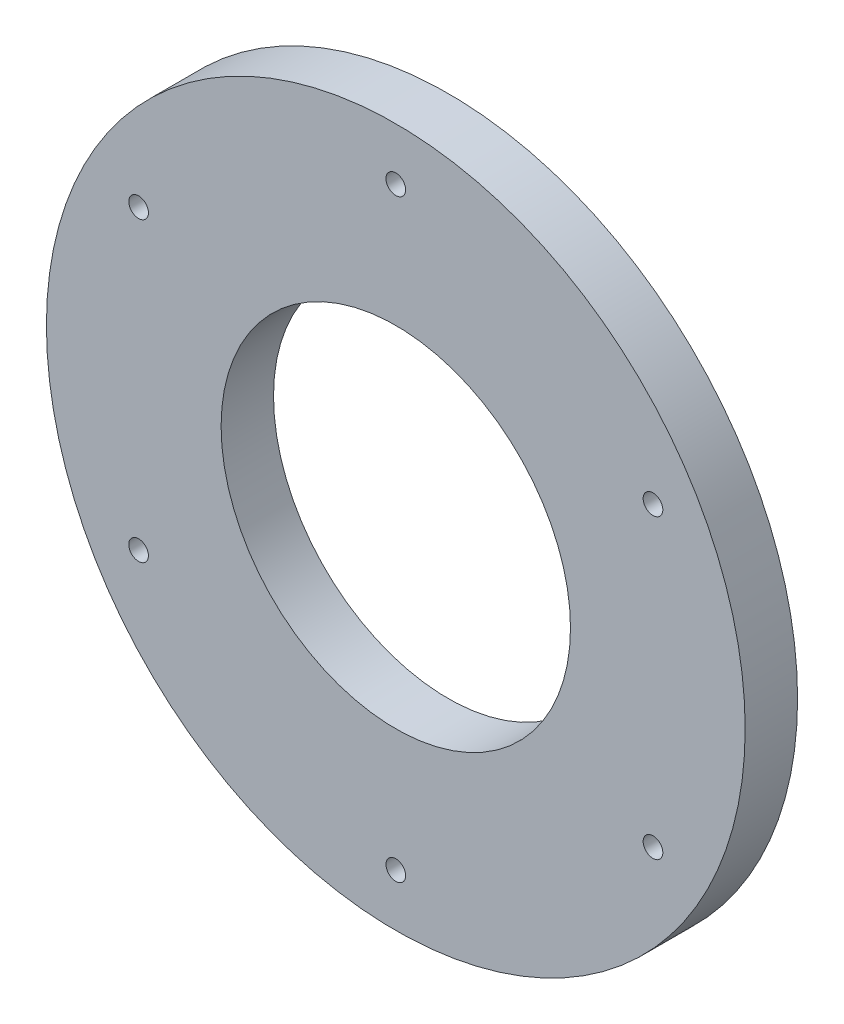
ISO-10303-21;
HEADER;
FILE_DESCRIPTION(('STEP AP214'),'2;1');
FILE_NAME('part.step','',(''),(''),'','','');
FILE_SCHEMA(('AUTOMOTIVE_DESIGN { 1 0 10303 214 1 1 1 1 }'));
ENDSEC;
DATA;
#1=APPLICATION_CONTEXT('core data for automotive mechanical design processes');
#2=APPLICATION_PROTOCOL_DEFINITION('international standard','automotive_design',2000,#1);
#3=PRODUCT_CONTEXT('',#1,'mechanical');
#4=PRODUCT('Part','Part','',(#3));
#5=PRODUCT_RELATED_PRODUCT_CATEGORY('part','',(#4));
#6=PRODUCT_DEFINITION_FORMATION('','',#4);
#7=PRODUCT_DEFINITION_CONTEXT('part definition',#1,'design');
#8=PRODUCT_DEFINITION('design','',#6,#7);
#9=PRODUCT_DEFINITION_SHAPE('','',#8);
#10=(LENGTH_UNIT() NAMED_UNIT(*) SI_UNIT(.MILLI.,.METRE.));
#11=(NAMED_UNIT(*) PLANE_ANGLE_UNIT() SI_UNIT($,.RADIAN.));
#12=(NAMED_UNIT(*) SI_UNIT($,.STERADIAN.) SOLID_ANGLE_UNIT());
#13=UNCERTAINTY_MEASURE_WITH_UNIT(LENGTH_MEASURE(1.E-05),#10,'distance_accuracy_value','');
#14=(GEOMETRIC_REPRESENTATION_CONTEXT(3) GLOBAL_UNCERTAINTY_ASSIGNED_CONTEXT((#13)) GLOBAL_UNIT_ASSIGNED_CONTEXT((#10,
#11,#12)) REPRESENTATION_CONTEXT('',''));
#15=CARTESIAN_POINT('',(0.,0.,0.));
#16=DIRECTION('',(0.,0.,1.));
#17=DIRECTION('',(1.,0.,0.));
#18=AXIS2_PLACEMENT_3D('',#15,#16,#17);
#19=CARTESIAN_POINT('',(0.,0.,19.05));
#20=DIRECTION('',(0.,0.,-1.));
#21=DIRECTION('',(-1.,0.,0.));
#22=AXIS2_PLACEMENT_3D('',#19,#20,#21);
#23=CYLINDRICAL_SURFACE('',#22,127.);
#24=CARTESIAN_POINT('',(0.,0.,19.05));
#25=DIRECTION('',(0.,0.,1.));
#26=DIRECTION('',(1.,0.,0.));
#27=AXIS2_PLACEMENT_3D('',#24,#25,#26);
#28=CIRCLE('',#27,127.);
#29=CARTESIAN_POINT('',(-127.,0.,19.05));
#30=VERTEX_POINT('',#29);
#31=EDGE_CURVE('E10',#30,#30,#28,.T.);
#32=CARTESIAN_POINT('',(0.,0.,0.));
#33=DIRECTION('',(0.,0.,1.));
#34=DIRECTION('',(1.,0.,0.));
#35=AXIS2_PLACEMENT_3D('',#32,#33,#34);
#36=CIRCLE('',#35,127.);
#37=CARTESIAN_POINT('',(-127.,0.,0.));
#38=VERTEX_POINT('',#37);
#39=EDGE_CURVE('E45',#38,#38,#36,.T.);
#40=CARTESIAN_POINT('',(-127.,0.,19.05));
#41=CARTESIAN_POINT('',(-127.,0.,18.8515625));
#42=CARTESIAN_POINT('',(-127.,0.,18.653125));
#43=CARTESIAN_POINT('',(-127.,0.,18.25625));
#44=CARTESIAN_POINT('',(-127.,0.,18.0578125));
#45=CARTESIAN_POINT('',(-127.,0.,17.6609375));
#46=CARTESIAN_POINT('',(-127.,0.,17.4625));
#47=CARTESIAN_POINT('',(-127.,0.,17.065625));
#48=CARTESIAN_POINT('',(-127.,0.,16.8671875));
#49=CARTESIAN_POINT('',(-127.,0.,16.4703125));
#50=CARTESIAN_POINT('',(-127.,0.,16.271875));
#51=CARTESIAN_POINT('',(-127.,0.,15.875));
#52=CARTESIAN_POINT('',(-127.,0.,15.6765625));
#53=CARTESIAN_POINT('',(-127.,0.,15.2796875));
#54=CARTESIAN_POINT('',(-127.,0.,15.08125));
#55=CARTESIAN_POINT('',(-127.,0.,14.684375));
#56=CARTESIAN_POINT('',(-127.,0.,14.4859375));
#57=CARTESIAN_POINT('',(-127.,0.,14.0890625));
#58=CARTESIAN_POINT('',(-127.,0.,13.890625));
#59=CARTESIAN_POINT('',(-127.,0.,13.49375));
#60=CARTESIAN_POINT('',(-127.,0.,13.2953125));
#61=CARTESIAN_POINT('',(-127.,0.,12.8984375));
#62=CARTESIAN_POINT('',(-127.,0.,12.7));
#63=CARTESIAN_POINT('',(-127.,0.,12.303125));
#64=CARTESIAN_POINT('',(-127.,0.,12.1046875));
#65=CARTESIAN_POINT('',(-127.,0.,11.7078125));
#66=CARTESIAN_POINT('',(-127.,0.,11.509375));
#67=CARTESIAN_POINT('',(-127.,0.,11.1125));
#68=CARTESIAN_POINT('',(-127.,0.,10.9140625));
#69=CARTESIAN_POINT('',(-127.,0.,10.5171875));
#70=CARTESIAN_POINT('',(-127.,0.,10.31875));
#71=CARTESIAN_POINT('',(-127.,0.,9.921875));
#72=CARTESIAN_POINT('',(-127.,0.,9.7234375));
#73=CARTESIAN_POINT('',(-127.,0.,9.3265625));
#74=CARTESIAN_POINT('',(-127.,0.,9.128125));
#75=CARTESIAN_POINT('',(-127.,0.,8.73125));
#76=CARTESIAN_POINT('',(-127.,0.,8.5328125));
#77=CARTESIAN_POINT('',(-127.,0.,8.1359375));
#78=CARTESIAN_POINT('',(-127.,0.,7.9375));
#79=CARTESIAN_POINT('',(-127.,0.,7.540625));
#80=CARTESIAN_POINT('',(-127.,0.,7.3421875));
#81=CARTESIAN_POINT('',(-127.,0.,6.9453125));
#82=CARTESIAN_POINT('',(-127.,0.,6.746875));
#83=CARTESIAN_POINT('',(-127.,0.,6.35));
#84=CARTESIAN_POINT('',(-127.,0.,6.1515625));
#85=CARTESIAN_POINT('',(-127.,0.,5.7546875));
#86=CARTESIAN_POINT('',(-127.,0.,5.55625));
#87=CARTESIAN_POINT('',(-127.,0.,5.159375));
#88=CARTESIAN_POINT('',(-127.,0.,4.9609375));
#89=CARTESIAN_POINT('',(-127.,0.,4.5640625));
#90=CARTESIAN_POINT('',(-127.,0.,4.365625));
#91=CARTESIAN_POINT('',(-127.,0.,3.96875));
#92=CARTESIAN_POINT('',(-127.,0.,3.7703125));
#93=CARTESIAN_POINT('',(-127.,0.,3.3734375));
#94=CARTESIAN_POINT('',(-127.,0.,3.175));
#95=CARTESIAN_POINT('',(-127.,0.,2.778125));
#96=CARTESIAN_POINT('',(-127.,0.,2.5796875));
#97=CARTESIAN_POINT('',(-127.,0.,2.1828125));
#98=CARTESIAN_POINT('',(-127.,0.,1.984375));
#99=CARTESIAN_POINT('',(-127.,0.,1.5875));
#100=CARTESIAN_POINT('',(-127.,0.,1.3890625));
#101=CARTESIAN_POINT('',(-127.,0.,0.992187500000001));
#102=CARTESIAN_POINT('',(-127.,0.,0.793750000000001));
#103=CARTESIAN_POINT('',(-127.,0.,0.396875));
#104=CARTESIAN_POINT('',(-127.,0.,0.1984375));
#105=CARTESIAN_POINT('',(-127.,0.,0.));
#106=B_SPLINE_CURVE_WITH_KNOTS('',3,(#40,#41,#42,#43,#44,#45,#46,#47,#48,#49,#50,#51,#52,#53,
#54,#55,#56,#57,#58,#59,#60,#61,#62,#63,#64,#65,#66,#67,#68,#69,#70,#71,#72,#73,#74,#75,#76,#77,
#78,#79,#80,#81,#82,#83,#84,#85,#86,#87,#88,#89,#90,#91,#92,#93,#94,#95,#96,#97,#98,#99,#100,
#101,#102,#103,#104,#105),.UNSPECIFIED.,.F.,.F.,(4,2,2,2,2,2,2,2,2,2,2,2,2,2,2,2,2,2,2,2,2,2,2,
2,2,2,2,2,2,2,2,2,4),(0.,0.595312499999997,1.190625,1.7859375,2.38125,2.9765625,3.571875,
4.1671875,4.7625,5.3578125,5.953125,6.5484375,7.14375,7.7390625,8.334375,8.9296875,9.525,
10.1203125,10.715625,11.3109375,11.90625,12.5015625,13.096875,13.6921875,14.2875,14.8828125,
15.478125,16.0734375,16.66875,17.2640625,17.859375,18.4546875,19.05),.UNSPECIFIED.);
#107=EDGE_CURVE('BSEAM42',#30,#38,#106,.T.);
#108=ORIENTED_EDGE('',*,*,#31,.F.);
#109=ORIENTED_EDGE('',*,*,#39,.T.);
#110=ORIENTED_EDGE('',*,*,#107,.T.);
#111=ORIENTED_EDGE('',*,*,#107,.F.);
#112=EDGE_LOOP('',(#108,#110,#109,#111));
#113=FACE_BOUND('',#112,.T.);
#114=ADVANCED_FACE('F42',(#113),#23,.T.);
#115=CARTESIAN_POINT('',(0.,0.,19.05));
#116=DIRECTION('',(0.,0.,1.));
#117=DIRECTION('',(1.,0.,0.));
#118=AXIS2_PLACEMENT_3D('',#115,#116,#117);
#119=PLANE('',#118);
#120=CARTESIAN_POINT('',(0.,0.,19.05));
#121=DIRECTION('',(0.,0.,1.));
#122=DIRECTION('',(1.,0.,0.));
#123=AXIS2_PLACEMENT_3D('',#120,#121,#122);
#124=CIRCLE('',#123,63.5);
#125=CARTESIAN_POINT('',(63.5,0.,19.05));
#126=VERTEX_POINT('',#125);
#127=EDGE_CURVE('E107',#126,#126,#124,.T.);
#128=ORIENTED_EDGE('',*,*,#127,.F.);
#129=EDGE_LOOP('',(#128));
#130=FACE_BOUND('',#129,.T.);
#131=CARTESIAN_POINT('',(0.,107.95,19.05));
#132=DIRECTION('',(0.,0.,1.));
#133=DIRECTION('',(1.,0.,0.));
#134=AXIS2_PLACEMENT_3D('',#131,#132,#133);
#135=CIRCLE('',#134,3.57124);
#136=CARTESIAN_POINT('',(3.57124,107.95,19.05));
#137=VERTEX_POINT('',#136);
#138=EDGE_CURVE('E99',#137,#137,#135,.T.);
#139=ORIENTED_EDGE('',*,*,#138,.F.);
#140=EDGE_LOOP('',(#139));
#141=FACE_BOUND('',#140,.T.);
#142=CARTESIAN_POINT('',(93.4874423385301,53.975,19.05));
#143=DIRECTION('',(0.,0.,1.));
#144=DIRECTION('',(1.,0.,0.));
#145=AXIS2_PLACEMENT_3D('',#142,#143,#144);
#146=CIRCLE('',#145,3.57124);
#147=CARTESIAN_POINT('',(97.0586823385301,53.975,19.05));
#148=VERTEX_POINT('',#147);
#149=EDGE_CURVE('E91',#148,#148,#146,.T.);
#150=ORIENTED_EDGE('',*,*,#149,.F.);
#151=EDGE_LOOP('',(#150));
#152=FACE_BOUND('',#151,.T.);
#153=CARTESIAN_POINT('',(93.4874423385302,-53.975,19.05));
#154=DIRECTION('',(0.,0.,1.));
#155=DIRECTION('',(1.,0.,0.));
#156=AXIS2_PLACEMENT_3D('',#153,#154,#155);
#157=CIRCLE('',#156,3.57124);
#158=CARTESIAN_POINT('',(97.0586823385302,-53.975,19.05));
#159=VERTEX_POINT('',#158);
#160=EDGE_CURVE('E83',#159,#159,#157,.T.);
#161=ORIENTED_EDGE('',*,*,#160,.F.);
#162=EDGE_LOOP('',(#161));
#163=FACE_BOUND('',#162,.T.);
#164=CARTESIAN_POINT('',(0.,-107.95,19.05));
#165=DIRECTION('',(0.,0.,1.));
#166=DIRECTION('',(1.,0.,0.));
#167=AXIS2_PLACEMENT_3D('',#164,#165,#166);
#168=CIRCLE('',#167,3.57124);
#169=CARTESIAN_POINT('',(3.57124000000001,-107.95,19.05));
#170=VERTEX_POINT('',#169);
#171=EDGE_CURVE('E75',#170,#170,#168,.T.);
#172=ORIENTED_EDGE('',*,*,#171,.F.);
#173=EDGE_LOOP('',(#172));
#174=FACE_BOUND('',#173,.T.);
#175=CARTESIAN_POINT('',(-93.4874423385301,-53.975,19.05));
#176=DIRECTION('',(0.,0.,1.));
#177=DIRECTION('',(1.,0.,0.));
#178=AXIS2_PLACEMENT_3D('',#175,#176,#177);
#179=CIRCLE('',#178,3.57124);
#180=CARTESIAN_POINT('',(-89.9162023385301,-53.975,19.05));
#181=VERTEX_POINT('',#180);
#182=EDGE_CURVE('E67',#181,#181,#179,.T.);
#183=ORIENTED_EDGE('',*,*,#182,.F.);
#184=EDGE_LOOP('',(#183));
#185=FACE_BOUND('',#184,.T.);
#186=CARTESIAN_POINT('',(-93.4874423385302,53.975,19.05));
#187=DIRECTION('',(0.,0.,1.));
#188=DIRECTION('',(1.,0.,0.));
#189=AXIS2_PLACEMENT_3D('',#186,#187,#188);
#190=CIRCLE('',#189,3.57124);
#191=CARTESIAN_POINT('',(-89.9162023385302,53.975,19.05));
#192=VERTEX_POINT('',#191);
#193=EDGE_CURVE('E59',#192,#192,#190,.T.);
#194=ORIENTED_EDGE('',*,*,#193,.F.);
#195=EDGE_LOOP('',(#194));
#196=FACE_BOUND('',#195,.T.);
#197=ORIENTED_EDGE('',*,*,#31,.T.);
#198=EDGE_LOOP('',(#197));
#199=FACE_BOUND('',#198,.T.);
#200=ADVANCED_FACE('F115',(#130,#141,#152,#163,#174,#185,#196,#199),#119,.T.);
#201=CARTESIAN_POINT('',(0.,0.,0.));
#202=DIRECTION('',(0.,0.,1.));
#203=DIRECTION('',(1.,0.,0.));
#204=AXIS2_PLACEMENT_3D('',#201,#202,#203);
#205=PLANE('',#204);
#206=CARTESIAN_POINT('',(0.,0.,0.));
#207=DIRECTION('',(0.,0.,1.));
#208=DIRECTION('',(1.,0.,0.));
#209=AXIS2_PLACEMENT_3D('',#206,#207,#208);
#210=CIRCLE('',#209,63.5);
#211=CARTESIAN_POINT('',(63.5,0.,0.));
#212=VERTEX_POINT('',#211);
#213=EDGE_CURVE('E103',#212,#212,#210,.F.);
#214=ORIENTED_EDGE('',*,*,#213,.F.);
#215=EDGE_LOOP('',(#214));
#216=FACE_BOUND('',#215,.T.);
#217=CARTESIAN_POINT('',(0.,107.95,0.));
#218=DIRECTION('',(0.,0.,1.));
#219=DIRECTION('',(1.,0.,0.));
#220=AXIS2_PLACEMENT_3D('',#217,#218,#219);
#221=CIRCLE('',#220,3.57124);
#222=CARTESIAN_POINT('',(3.57124,107.95,0.));
#223=VERTEX_POINT('',#222);
#224=EDGE_CURVE('E95',#223,#223,#221,.T.);
#225=ORIENTED_EDGE('',*,*,#224,.T.);
#226=EDGE_LOOP('',(#225));
#227=FACE_BOUND('',#226,.T.);
#228=CARTESIAN_POINT('',(93.4874423385301,53.975,0.));
#229=DIRECTION('',(0.,0.,1.));
#230=DIRECTION('',(1.,0.,0.));
#231=AXIS2_PLACEMENT_3D('',#228,#229,#230);
#232=CIRCLE('',#231,3.57124);
#233=CARTESIAN_POINT('',(97.0586823385301,53.975,0.));
#234=VERTEX_POINT('',#233);
#235=EDGE_CURVE('E87',#234,#234,#232,.T.);
#236=ORIENTED_EDGE('',*,*,#235,.T.);
#237=EDGE_LOOP('',(#236));
#238=FACE_BOUND('',#237,.T.);
#239=CARTESIAN_POINT('',(93.4874423385302,-53.975,0.));
#240=DIRECTION('',(0.,0.,1.));
#241=DIRECTION('',(1.,0.,0.));
#242=AXIS2_PLACEMENT_3D('',#239,#240,#241);
#243=CIRCLE('',#242,3.57124);
#244=CARTESIAN_POINT('',(97.0586823385302,-53.975,0.));
#245=VERTEX_POINT('',#244);
#246=EDGE_CURVE('E79',#245,#245,#243,.T.);
#247=ORIENTED_EDGE('',*,*,#246,.T.);
#248=EDGE_LOOP('',(#247));
#249=FACE_BOUND('',#248,.T.);
#250=CARTESIAN_POINT('',(0.,-107.95,0.));
#251=DIRECTION('',(0.,0.,1.));
#252=DIRECTION('',(1.,0.,0.));
#253=AXIS2_PLACEMENT_3D('',#250,#251,#252);
#254=CIRCLE('',#253,3.57124);
#255=CARTESIAN_POINT('',(3.57124000000001,-107.95,0.));
#256=VERTEX_POINT('',#255);
#257=EDGE_CURVE('E71',#256,#256,#254,.T.);
#258=ORIENTED_EDGE('',*,*,#257,.T.);
#259=EDGE_LOOP('',(#258));
#260=FACE_BOUND('',#259,.T.);
#261=CARTESIAN_POINT('',(-93.4874423385301,-53.975,0.));
#262=DIRECTION('',(0.,0.,1.));
#263=DIRECTION('',(1.,0.,0.));
#264=AXIS2_PLACEMENT_3D('',#261,#262,#263);
#265=CIRCLE('',#264,3.57124);
#266=CARTESIAN_POINT('',(-89.9162023385301,-53.975,0.));
#267=VERTEX_POINT('',#266);
#268=EDGE_CURVE('E63',#267,#267,#265,.T.);
#269=ORIENTED_EDGE('',*,*,#268,.T.);
#270=EDGE_LOOP('',(#269));
#271=FACE_BOUND('',#270,.T.);
#272=CARTESIAN_POINT('',(-93.4874423385302,53.975,0.));
#273=DIRECTION('',(0.,0.,1.));
#274=DIRECTION('',(1.,0.,0.));
#275=AXIS2_PLACEMENT_3D('',#272,#273,#274);
#276=CIRCLE('',#275,3.57124);
#277=CARTESIAN_POINT('',(-89.9162023385302,53.975,0.));
#278=VERTEX_POINT('',#277);
#279=EDGE_CURVE('E54',#278,#278,#276,.T.);
#280=ORIENTED_EDGE('',*,*,#279,.T.);
#281=EDGE_LOOP('',(#280));
#282=FACE_BOUND('',#281,.T.);
#283=ORIENTED_EDGE('',*,*,#39,.F.);
#284=EDGE_LOOP('',(#283));
#285=FACE_BOUND('',#284,.T.);
#286=ADVANCED_FACE('F118',(#216,#227,#238,#249,#260,#271,#282,#285),#205,.F.);
#287=CARTESIAN_POINT('',(-93.4874423385302,53.975,19.05));
#288=DIRECTION('',(0.,0.,1.));
#289=DIRECTION('',(1.,0.,0.));
#290=AXIS2_PLACEMENT_3D('',#287,#288,#289);
#291=CYLINDRICAL_SURFACE('',#290,3.57124);
#292=ORIENTED_EDGE('',*,*,#279,.F.);
#293=EDGE_LOOP('',(#292));
#294=FACE_BOUND('',#293,.T.);
#295=ORIENTED_EDGE('',*,*,#193,.T.);
#296=EDGE_LOOP('',(#295));
#297=FACE_BOUND('',#296,.T.);
#298=ADVANCED_FACE('F132',(#294,#297),#291,.F.);
#299=CARTESIAN_POINT('',(-93.4874423385301,-53.975,19.05));
#300=DIRECTION('',(0.,0.,1.));
#301=DIRECTION('',(1.,0.,0.));
#302=AXIS2_PLACEMENT_3D('',#299,#300,#301);
#303=CYLINDRICAL_SURFACE('',#302,3.57124);
#304=ORIENTED_EDGE('',*,*,#268,.F.);
#305=EDGE_LOOP('',(#304));
#306=FACE_BOUND('',#305,.T.);
#307=ORIENTED_EDGE('',*,*,#182,.T.);
#308=EDGE_LOOP('',(#307));
#309=FACE_BOUND('',#308,.T.);
#310=ADVANCED_FACE('F134',(#306,#309),#303,.F.);
#311=CARTESIAN_POINT('',(0.,-107.95,19.05));
#312=DIRECTION('',(0.,0.,1.));
#313=DIRECTION('',(1.,0.,0.));
#314=AXIS2_PLACEMENT_3D('',#311,#312,#313);
#315=CYLINDRICAL_SURFACE('',#314,3.57124);
#316=ORIENTED_EDGE('',*,*,#257,.F.);
#317=EDGE_LOOP('',(#316));
#318=FACE_BOUND('',#317,.T.);
#319=ORIENTED_EDGE('',*,*,#171,.T.);
#320=EDGE_LOOP('',(#319));
#321=FACE_BOUND('',#320,.T.);
#322=ADVANCED_FACE('F141',(#318,#321),#315,.F.);
#323=CARTESIAN_POINT('',(93.4874423385302,-53.975,19.05));
#324=DIRECTION('',(0.,0.,1.));
#325=DIRECTION('',(1.,0.,0.));
#326=AXIS2_PLACEMENT_3D('',#323,#324,#325);
#327=CYLINDRICAL_SURFACE('',#326,3.57124);
#328=ORIENTED_EDGE('',*,*,#246,.F.);
#329=EDGE_LOOP('',(#328));
#330=FACE_BOUND('',#329,.T.);
#331=ORIENTED_EDGE('',*,*,#160,.T.);
#332=EDGE_LOOP('',(#331));
#333=FACE_BOUND('',#332,.T.);
#334=ADVANCED_FACE('F187',(#330,#333),#327,.F.);
#335=CARTESIAN_POINT('',(93.4874423385301,53.975,19.05));
#336=DIRECTION('',(0.,0.,1.));
#337=DIRECTION('',(1.,0.,0.));
#338=AXIS2_PLACEMENT_3D('',#335,#336,#337);
#339=CYLINDRICAL_SURFACE('',#338,3.57124);
#340=ORIENTED_EDGE('',*,*,#235,.F.);
#341=EDGE_LOOP('',(#340));
#342=FACE_BOUND('',#341,.T.);
#343=ORIENTED_EDGE('',*,*,#149,.T.);
#344=EDGE_LOOP('',(#343));
#345=FACE_BOUND('',#344,.T.);
#346=ADVANCED_FACE('F197',(#342,#345),#339,.F.);
#347=CARTESIAN_POINT('',(0.,107.95,19.05));
#348=DIRECTION('',(0.,0.,1.));
#349=DIRECTION('',(1.,0.,0.));
#350=AXIS2_PLACEMENT_3D('',#347,#348,#349);
#351=CYLINDRICAL_SURFACE('',#350,3.57124);
#352=ORIENTED_EDGE('',*,*,#224,.F.);
#353=EDGE_LOOP('',(#352));
#354=FACE_BOUND('',#353,.T.);
#355=ORIENTED_EDGE('',*,*,#138,.T.);
#356=EDGE_LOOP('',(#355));
#357=FACE_BOUND('',#356,.T.);
#358=ADVANCED_FACE('F207',(#354,#357),#351,.F.);
#359=CARTESIAN_POINT('',(0.,0.,-0.001000000000001));
#360=DIRECTION('',(0.,0.,1.));
#361=DIRECTION('',(1.,0.,0.));
#362=AXIS2_PLACEMENT_3D('',#359,#360,#361);
#363=CYLINDRICAL_SURFACE('',#362,63.5);
#364=ORIENTED_EDGE('',*,*,#127,.T.);
#365=EDGE_LOOP('',(#364));
#366=FACE_BOUND('',#365,.T.);
#367=ORIENTED_EDGE('',*,*,#213,.T.);
#368=EDGE_LOOP('',(#367));
#369=FACE_BOUND('',#368,.T.);
#370=ADVANCED_FACE('F112',(#366,#369),#363,.F.);
#371=CLOSED_SHELL('',(#114,#200,#286,#298,#310,#322,#334,#346,#358,#370));
#372=MANIFOLD_SOLID_BREP('B2',#371);
#373=ADVANCED_BREP_SHAPE_REPRESENTATION('',(#18,#372),#14);
#374=SHAPE_DEFINITION_REPRESENTATION(#9,#373);
ENDSEC;
END-ISO-10303-21;
